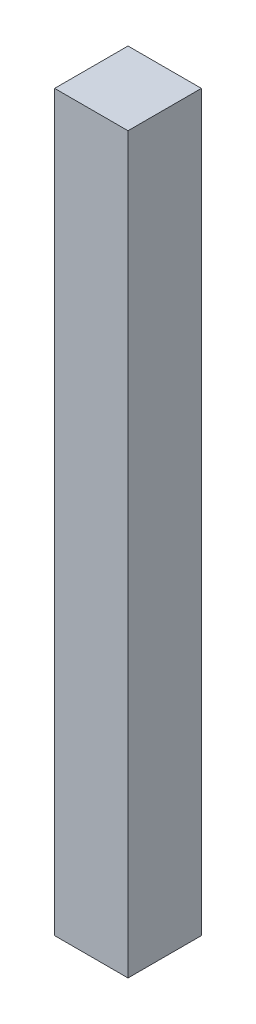
ISO-10303-21;
HEADER;
FILE_DESCRIPTION(('STEP AP214'),'2;1');
FILE_NAME('part.step','',(''),(''),'','','');
FILE_SCHEMA(('AUTOMOTIVE_DESIGN { 1 0 10303 214 1 1 1 1 }'));
ENDSEC;
DATA;
#1=APPLICATION_CONTEXT('core data for automotive mechanical design processes');
#2=APPLICATION_PROTOCOL_DEFINITION('international standard','automotive_design',2000,#1);
#3=PRODUCT_CONTEXT('',#1,'mechanical');
#4=PRODUCT('Part','Part','',(#3));
#5=PRODUCT_RELATED_PRODUCT_CATEGORY('part','',(#4));
#6=PRODUCT_DEFINITION_FORMATION('','',#4);
#7=PRODUCT_DEFINITION_CONTEXT('part definition',#1,'design');
#8=PRODUCT_DEFINITION('design','',#6,#7);
#9=PRODUCT_DEFINITION_SHAPE('','',#8);
#10=(LENGTH_UNIT() NAMED_UNIT(*) SI_UNIT(.MILLI.,.METRE.));
#11=(NAMED_UNIT(*) PLANE_ANGLE_UNIT() SI_UNIT($,.RADIAN.));
#12=(NAMED_UNIT(*) SI_UNIT($,.STERADIAN.) SOLID_ANGLE_UNIT());
#13=UNCERTAINTY_MEASURE_WITH_UNIT(LENGTH_MEASURE(1.E-05),#10,'distance_accuracy_value','');
#14=(GEOMETRIC_REPRESENTATION_CONTEXT(3) GLOBAL_UNCERTAINTY_ASSIGNED_CONTEXT((#13)) GLOBAL_UNIT_ASSIGNED_CONTEXT((#10,
#11,#12)) REPRESENTATION_CONTEXT('',''));
#15=CARTESIAN_POINT('',(0.,0.,0.));
#16=DIRECTION('',(0.,0.,1.));
#17=DIRECTION('',(1.,0.,0.));
#18=AXIS2_PLACEMENT_3D('',#15,#16,#17);
#19=CARTESIAN_POINT('',(10.,200.,-10.));
#20=DIRECTION('',(-1.,0.,0.));
#21=DIRECTION('',(0.,0.,1.));
#22=AXIS2_PLACEMENT_3D('',#19,#20,#21);
#23=PLANE('',#22);
#24=DIRECTION('',(0.,0.,-1.));
#25=VECTOR('',#24,1.);
#26=CARTESIAN_POINT('',(10.,0.,-10.));
#27=LINE('',#26,#25);
#28=CARTESIAN_POINT('',(10.,0.,10.));
#29=VERTEX_POINT('',#28);
#30=CARTESIAN_POINT('',(10.,0.,-10.));
#31=VERTEX_POINT('',#30);
#32=EDGE_CURVE('E103',#29,#31,#27,.T.);
#33=ORIENTED_EDGE('',*,*,#32,.T.);
#34=DIRECTION('',(0.,-1.,0.));
#35=VECTOR('',#34,1.);
#36=CARTESIAN_POINT('',(10.,200.,-10.));
#37=LINE('',#36,#35);
#38=CARTESIAN_POINT('',(10.,200.,-10.));
#39=VERTEX_POINT('',#38);
#40=EDGE_CURVE('E11',#39,#31,#37,.T.);
#41=ORIENTED_EDGE('',*,*,#40,.F.);
#42=DIRECTION('',(0.,0.,-1.));
#43=VECTOR('',#42,1.);
#44=CARTESIAN_POINT('',(10.,200.,-10.));
#45=LINE('',#44,#43);
#46=CARTESIAN_POINT('',(10.,200.,10.));
#47=VERTEX_POINT('',#46);
#48=EDGE_CURVE('E91',#47,#39,#45,.T.);
#49=ORIENTED_EDGE('',*,*,#48,.F.);
#50=DIRECTION('',(0.,-1.,0.));
#51=VECTOR('',#50,1.);
#52=CARTESIAN_POINT('',(10.,200.,10.));
#53=LINE('',#52,#51);
#54=EDGE_CURVE('E99',#47,#29,#53,.T.);
#55=ORIENTED_EDGE('',*,*,#54,.T.);
#56=EDGE_LOOP('',(#33,#41,#49,#55));
#57=FACE_BOUND('',#56,.T.);
#58=ADVANCED_FACE('F40',(#57),#23,.F.);
#59=CARTESIAN_POINT('',(-10.,200.,-10.));
#60=DIRECTION('',(0.,0.,1.));
#61=DIRECTION('',(1.,0.,0.));
#62=AXIS2_PLACEMENT_3D('',#59,#60,#61);
#63=PLANE('',#62);
#64=DIRECTION('',(-1.,0.,0.));
#65=VECTOR('',#64,1.);
#66=CARTESIAN_POINT('',(-10.,0.,-10.));
#67=LINE('',#66,#65);
#68=CARTESIAN_POINT('',(-10.,0.,-10.));
#69=VERTEX_POINT('',#68);
#70=EDGE_CURVE('E95',#31,#69,#67,.T.);
#71=ORIENTED_EDGE('',*,*,#70,.T.);
#72=DIRECTION('',(0.,-1.,0.));
#73=VECTOR('',#72,1.);
#74=CARTESIAN_POINT('',(-10.,200.,-10.));
#75=LINE('',#74,#73);
#76=CARTESIAN_POINT('',(-10.,200.,-10.));
#77=VERTEX_POINT('',#76);
#78=EDGE_CURVE('E48',#77,#69,#75,.T.);
#79=ORIENTED_EDGE('',*,*,#78,.F.);
#80=DIRECTION('',(-1.,0.,0.));
#81=VECTOR('',#80,1.);
#82=CARTESIAN_POINT('',(-10.,200.,-10.));
#83=LINE('',#82,#81);
#84=EDGE_CURVE('E86',#39,#77,#83,.T.);
#85=ORIENTED_EDGE('',*,*,#84,.F.);
#86=ORIENTED_EDGE('',*,*,#40,.T.);
#87=EDGE_LOOP('',(#71,#79,#85,#86));
#88=FACE_BOUND('',#87,.T.);
#89=ADVANCED_FACE('F94',(#88),#63,.F.);
#90=CARTESIAN_POINT('',(-10.,200.,-10.));
#91=DIRECTION('',(1.,0.,0.));
#92=DIRECTION('',(0.,0.,-1.));
#93=AXIS2_PLACEMENT_3D('',#90,#91,#92);
#94=PLANE('',#93);
#95=DIRECTION('',(0.,0.,1.));
#96=VECTOR('',#95,1.);
#97=CARTESIAN_POINT('',(-10.,0.,-10.));
#98=LINE('',#97,#96);
#99=CARTESIAN_POINT('',(-10.,0.,10.));
#100=VERTEX_POINT('',#99);
#101=EDGE_CURVE('E73',#69,#100,#98,.T.);
#102=ORIENTED_EDGE('',*,*,#101,.T.);
#103=DIRECTION('',(0.,-1.,0.));
#104=VECTOR('',#103,1.);
#105=CARTESIAN_POINT('',(-10.,200.,10.));
#106=LINE('',#105,#104);
#107=CARTESIAN_POINT('',(-10.,200.,10.));
#108=VERTEX_POINT('',#107);
#109=EDGE_CURVE('E96',#108,#100,#106,.T.);
#110=ORIENTED_EDGE('',*,*,#109,.F.);
#111=DIRECTION('',(0.,0.,1.));
#112=VECTOR('',#111,1.);
#113=CARTESIAN_POINT('',(-10.,200.,-10.));
#114=LINE('',#113,#112);
#115=EDGE_CURVE('E89',#77,#108,#114,.T.);
#116=ORIENTED_EDGE('',*,*,#115,.F.);
#117=ORIENTED_EDGE('',*,*,#78,.T.);
#118=EDGE_LOOP('',(#102,#110,#116,#117));
#119=FACE_BOUND('',#118,.T.);
#120=ADVANCED_FACE('F97',(#119),#94,.F.);
#121=CARTESIAN_POINT('',(-10.,200.,10.));
#122=DIRECTION('',(0.,0.,-1.));
#123=DIRECTION('',(-1.,0.,0.));
#124=AXIS2_PLACEMENT_3D('',#121,#122,#123);
#125=PLANE('',#124);
#126=DIRECTION('',(1.,0.,0.));
#127=VECTOR('',#126,1.);
#128=CARTESIAN_POINT('',(-10.,0.,10.));
#129=LINE('',#128,#127);
#130=EDGE_CURVE('E79',#100,#29,#129,.T.);
#131=ORIENTED_EDGE('',*,*,#130,.T.);
#132=ORIENTED_EDGE('',*,*,#54,.F.);
#133=DIRECTION('',(1.,0.,0.));
#134=VECTOR('',#133,1.);
#135=CARTESIAN_POINT('',(-10.,200.,10.));
#136=LINE('',#135,#134);
#137=EDGE_CURVE('E56',#108,#47,#136,.T.);
#138=ORIENTED_EDGE('',*,*,#137,.F.);
#139=ORIENTED_EDGE('',*,*,#109,.T.);
#140=EDGE_LOOP('',(#131,#132,#138,#139));
#141=FACE_BOUND('',#140,.T.);
#142=ADVANCED_FACE('F110',(#141),#125,.F.);
#143=CARTESIAN_POINT('',(0.,200.,0.));
#144=DIRECTION('',(0.,1.,0.));
#145=DIRECTION('',(0.,0.,1.));
#146=AXIS2_PLACEMENT_3D('',#143,#144,#145);
#147=PLANE('',#146);
#148=ORIENTED_EDGE('',*,*,#48,.T.);
#149=ORIENTED_EDGE('',*,*,#84,.T.);
#150=ORIENTED_EDGE('',*,*,#115,.T.);
#151=ORIENTED_EDGE('',*,*,#137,.T.);
#152=EDGE_LOOP('',(#148,#149,#150,#151));
#153=FACE_BOUND('',#152,.T.);
#154=ADVANCED_FACE('F87',(#153),#147,.T.);
#155=CARTESIAN_POINT('',(0.,0.,0.));
#156=DIRECTION('',(0.,1.,0.));
#157=DIRECTION('',(0.,0.,1.));
#158=AXIS2_PLACEMENT_3D('',#155,#156,#157);
#159=PLANE('',#158);
#160=ORIENTED_EDGE('',*,*,#32,.F.);
#161=ORIENTED_EDGE('',*,*,#130,.F.);
#162=ORIENTED_EDGE('',*,*,#101,.F.);
#163=ORIENTED_EDGE('',*,*,#70,.F.);
#164=EDGE_LOOP('',(#160,#161,#162,#163));
#165=FACE_BOUND('',#164,.T.);
#166=ADVANCED_FACE('F113',(#165),#159,.F.);
#167=CLOSED_SHELL('',(#58,#89,#120,#142,#154,#166));
#168=MANIFOLD_SOLID_BREP('B2',#167);
#169=ADVANCED_BREP_SHAPE_REPRESENTATION('',(#18,#168),#14);
#170=SHAPE_DEFINITION_REPRESENTATION(#9,#169);
ENDSEC;
END-ISO-10303-21;
